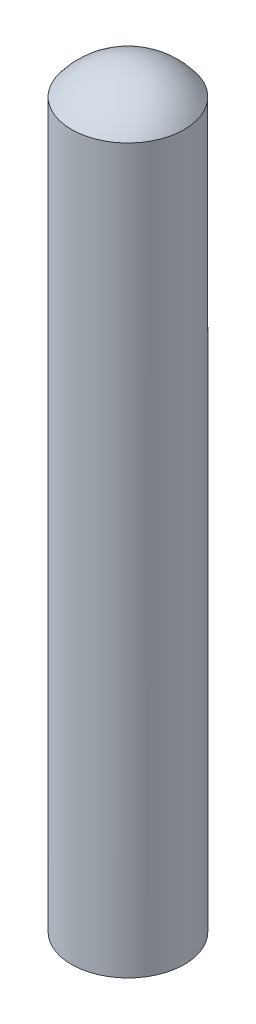
ISO-10303-21;
HEADER;
FILE_DESCRIPTION(('STEP AP214'),'2;1');
FILE_NAME('part.step','',(''),(''),'','','');
FILE_SCHEMA(('AUTOMOTIVE_DESIGN { 1 0 10303 214 1 1 1 1 }'));
ENDSEC;
DATA;
#1=APPLICATION_CONTEXT('core data for automotive mechanical design processes');
#2=APPLICATION_PROTOCOL_DEFINITION('international standard','automotive_design',2000,#1);
#3=PRODUCT_CONTEXT('',#1,'mechanical');
#4=PRODUCT('Part','Part','',(#3));
#5=PRODUCT_RELATED_PRODUCT_CATEGORY('part','',(#4));
#6=PRODUCT_DEFINITION_FORMATION('','',#4);
#7=PRODUCT_DEFINITION_CONTEXT('part definition',#1,'design');
#8=PRODUCT_DEFINITION('design','',#6,#7);
#9=PRODUCT_DEFINITION_SHAPE('','',#8);
#10=(LENGTH_UNIT() NAMED_UNIT(*) SI_UNIT(.MILLI.,.METRE.));
#11=(NAMED_UNIT(*) PLANE_ANGLE_UNIT() SI_UNIT($,.RADIAN.));
#12=(NAMED_UNIT(*) SI_UNIT($,.STERADIAN.) SOLID_ANGLE_UNIT());
#13=UNCERTAINTY_MEASURE_WITH_UNIT(LENGTH_MEASURE(1.E-05),#10,'distance_accuracy_value','');
#14=(GEOMETRIC_REPRESENTATION_CONTEXT(3) GLOBAL_UNCERTAINTY_ASSIGNED_CONTEXT((#13)) GLOBAL_UNIT_ASSIGNED_CONTEXT((#10,
#11,#12)) REPRESENTATION_CONTEXT('',''));
#15=CARTESIAN_POINT('',(0.,0.,0.));
#16=DIRECTION('',(0.,0.,1.));
#17=DIRECTION('',(1.,0.,0.));
#18=AXIS2_PLACEMENT_3D('',#15,#16,#17);
#19=CARTESIAN_POINT('',(2.99999999999999,0.,0.));
#20=DIRECTION('',(0.,1.,0.));
#21=DIRECTION('',(-1.,0.,0.));
#22=AXIS2_PLACEMENT_3D('',#19,#20,#21);
#23=PLANE('',#22);
#24=CARTESIAN_POINT('',(0.,0.,0.));
#25=DIRECTION('',(0.,1.,0.));
#26=DIRECTION('',(-1.,0.,0.));
#27=AXIS2_PLACEMENT_3D('',#24,#25,#26);
#28=CIRCLE('',#27,2.99999999999999);
#29=CARTESIAN_POINT('',(-2.99999999999999,0.,0.));
#30=VERTEX_POINT('',#29);
#31=EDGE_CURVE('E10',#30,#30,#28,.T.);
#32=ORIENTED_EDGE('',*,*,#31,.F.);
#33=EDGE_LOOP('',(#32));
#34=FACE_BOUND('',#33,.T.);
#35=ADVANCED_FACE('F33',(#34),#23,.F.);
#36=CARTESIAN_POINT('',(0.,39.9,0.));
#37=DIRECTION('',(0.,1.,0.));
#38=DIRECTION('',(-1.,0.,0.));
#39=AXIS2_PLACEMENT_3D('',#36,#37,#38);
#40=CYLINDRICAL_SURFACE('',#39,2.99999999999999);
#41=CARTESIAN_POINT('',(0.,38.4,0.));
#42=DIRECTION('',(0.,1.,0.));
#43=DIRECTION('',(-1.,0.,0.));
#44=AXIS2_PLACEMENT_3D('',#41,#42,#43);
#45=CIRCLE('',#44,2.99999999999999);
#46=CARTESIAN_POINT('',(-3.,38.4,0.));
#47=VERTEX_POINT('',#46);
#48=EDGE_CURVE('E39',#47,#47,#45,.T.);
#49=ORIENTED_EDGE('',*,*,#48,.F.);
#50=EDGE_LOOP('',(#49));
#51=FACE_BOUND('',#50,.T.);
#52=ORIENTED_EDGE('',*,*,#31,.T.);
#53=EDGE_LOOP('',(#52));
#54=FACE_BOUND('',#53,.T.);
#55=ADVANCED_FACE('F47',(#51,#54),#40,.T.);
#56=CARTESIAN_POINT('',(0.,36.15,0.));
#57=DIRECTION('',(0.,1.,0.));
#58=DIRECTION('',(1.,0.,0.));
#59=AXIS2_PLACEMENT_3D('',#56,#57,#58);
#60=SPHERICAL_SURFACE('',#59,3.75);
#61=ORIENTED_EDGE('',*,*,#48,.T.);
#62=EDGE_LOOP('',(#61));
#63=FACE_BOUND('',#62,.T.);
#64=ADVANCED_FACE('F45',(#63),#60,.T.);
#65=CLOSED_SHELL('',(#35,#55,#64));
#66=MANIFOLD_SOLID_BREP('B2',#65);
#67=ADVANCED_BREP_SHAPE_REPRESENTATION('',(#18,#66),#14);
#68=SHAPE_DEFINITION_REPRESENTATION(#9,#67);
ENDSEC;
END-ISO-10303-21;
